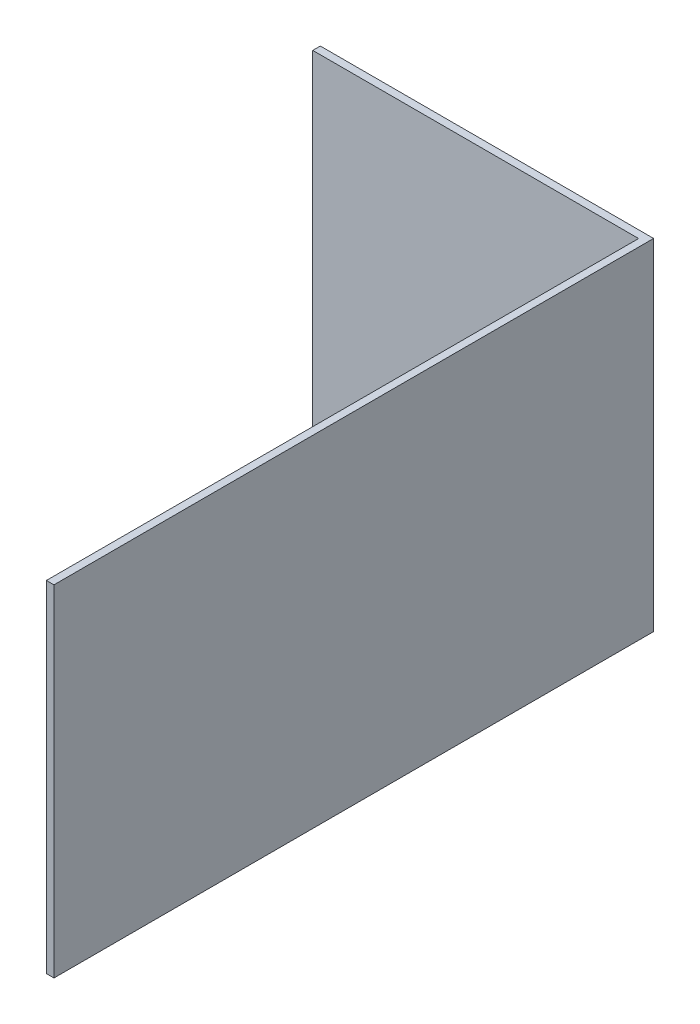
ISO-10303-21;
HEADER;
FILE_DESCRIPTION(('STEP AP214'),'2;1');
FILE_NAME('part.step','',(''),(''),'','','');
FILE_SCHEMA(('AUTOMOTIVE_DESIGN { 1 0 10303 214 1 1 1 1 }'));
ENDSEC;
DATA;
#1=APPLICATION_CONTEXT('core data for automotive mechanical design processes');
#2=APPLICATION_PROTOCOL_DEFINITION('international standard','automotive_design',2000,#1);
#3=PRODUCT_CONTEXT('',#1,'mechanical');
#4=PRODUCT('Part','Part','',(#3));
#5=PRODUCT_RELATED_PRODUCT_CATEGORY('part','',(#4));
#6=PRODUCT_DEFINITION_FORMATION('','',#4);
#7=PRODUCT_DEFINITION_CONTEXT('part definition',#1,'design');
#8=PRODUCT_DEFINITION('design','',#6,#7);
#9=PRODUCT_DEFINITION_SHAPE('','',#8);
#10=(LENGTH_UNIT() NAMED_UNIT(*) SI_UNIT(.MILLI.,.METRE.));
#11=(NAMED_UNIT(*) PLANE_ANGLE_UNIT() SI_UNIT($,.RADIAN.));
#12=(NAMED_UNIT(*) SI_UNIT($,.STERADIAN.) SOLID_ANGLE_UNIT());
#13=UNCERTAINTY_MEASURE_WITH_UNIT(LENGTH_MEASURE(1.E-05),#10,'distance_accuracy_value','');
#14=(GEOMETRIC_REPRESENTATION_CONTEXT(3) GLOBAL_UNCERTAINTY_ASSIGNED_CONTEXT((#13)) GLOBAL_UNIT_ASSIGNED_CONTEXT((#10,
#11,#12)) REPRESENTATION_CONTEXT('',''));
#15=CARTESIAN_POINT('',(0.,0.,0.));
#16=DIRECTION('',(0.,0.,1.));
#17=DIRECTION('',(1.,0.,0.));
#18=AXIS2_PLACEMENT_3D('',#15,#16,#17);
#19=CARTESIAN_POINT('',(359.999999999999,674.135566945079,-438.210637314264));
#20=DIRECTION('',(-0.999999965730541,0.,0.000261799384801581));
#21=DIRECTION('',(0.000261799384801581,0.,0.999999965730541));
#22=AXIS2_PLACEMENT_3D('',#19,#20,#21);
#23=PLANE('',#22);
#24=DIRECTION('',(-0.00026179938480158,0.,-0.999999965730541));
#25=VECTOR('',#24,1.);
#26=CARTESIAN_POINT('',(359.999999999999,0.,-438.210637314264));
#27=LINE('',#26,#25);
#28=CARTESIAN_POINT('',(360.310885989529,0.,749.286342905713));
#29=VERTEX_POINT('',#28);
#30=CARTESIAN_POINT('',(359.999999999999,0.,-438.210637314264));
#31=VERTEX_POINT('',#30);
#32=EDGE_CURVE('E117',#29,#31,#27,.T.);
#33=ORIENTED_EDGE('',*,*,#32,.T.);
#34=DIRECTION('',(0.,-1.,0.));
#35=VECTOR('',#34,1.);
#36=CARTESIAN_POINT('',(359.999999999999,674.135566945079,-438.210637314264));
#37=LINE('',#36,#35);
#38=CARTESIAN_POINT('',(359.999999999999,674.135566945079,-438.210637314264));
#39=VERTEX_POINT('',#38);
#40=EDGE_CURVE('E11',#39,#31,#37,.T.);
#41=ORIENTED_EDGE('',*,*,#40,.F.);
#42=DIRECTION('',(-0.00026179938480158,0.,-0.999999965730541));
#43=VECTOR('',#42,1.);
#44=CARTESIAN_POINT('',(359.999999999999,674.135566945079,-438.210637314264));
#45=LINE('',#44,#43);
#46=CARTESIAN_POINT('',(360.310885989529,674.135566945079,749.286342905713));
#47=VERTEX_POINT('',#46);
#48=EDGE_CURVE('E127',#47,#39,#45,.T.);
#49=ORIENTED_EDGE('',*,*,#48,.F.);
#50=DIRECTION('',(0.,-1.,0.));
#51=VECTOR('',#50,1.);
#52=CARTESIAN_POINT('',(360.310885989529,674.135566945079,749.286342905713));
#53=LINE('',#52,#51);
#54=EDGE_CURVE('E113',#47,#29,#53,.T.);
#55=ORIENTED_EDGE('',*,*,#54,.T.);
#56=EDGE_LOOP('',(#33,#41,#49,#55));
#57=FACE_BOUND('',#56,.T.);
#58=ADVANCED_FACE('F33',(#57),#23,.F.);
#59=CARTESIAN_POINT('',(-299.880046861604,674.135566945079,-438.210637314264));
#60=DIRECTION('',(0.,0.,1.));
#61=DIRECTION('',(1.,0.,0.));
#62=AXIS2_PLACEMENT_3D('',#59,#60,#61);
#63=PLANE('',#62);
#64=DIRECTION('',(-1.,0.,0.));
#65=VECTOR('',#64,1.);
#66=CARTESIAN_POINT('',(-299.880046861604,0.,-438.210637314264));
#67=LINE('',#66,#65);
#68=CARTESIAN_POINT('',(-299.880046861604,0.,-438.210637314264));
#69=VERTEX_POINT('',#68);
#70=EDGE_CURVE('E120',#31,#69,#67,.T.);
#71=ORIENTED_EDGE('',*,*,#70,.T.);
#72=DIRECTION('',(0.,-1.,0.));
#73=VECTOR('',#72,1.);
#74=CARTESIAN_POINT('',(-299.880046861604,674.135566945079,-438.210637314264));
#75=LINE('',#74,#73);
#76=CARTESIAN_POINT('',(-299.880046861604,674.135566945079,-438.210637314264));
#77=VERTEX_POINT('',#76);
#78=EDGE_CURVE('E41',#77,#69,#75,.T.);
#79=ORIENTED_EDGE('',*,*,#78,.F.);
#80=DIRECTION('',(-1.,0.,0.));
#81=VECTOR('',#80,1.);
#82=CARTESIAN_POINT('',(-299.880046861604,674.135566945079,-438.210637314264));
#83=LINE('',#82,#81);
#84=EDGE_CURVE('E86',#39,#77,#83,.T.);
#85=ORIENTED_EDGE('',*,*,#84,.F.);
#86=ORIENTED_EDGE('',*,*,#40,.T.);
#87=EDGE_LOOP('',(#71,#79,#85,#86));
#88=FACE_BOUND('',#87,.T.);
#89=ADVANCED_FACE('F151',(#88),#63,.F.);
#90=CARTESIAN_POINT('',(-299.880046861603,674.135566945079,-423.210637314775));
#91=DIRECTION('',(1.,0.,0.));
#92=DIRECTION('',(0.,0.,-1.));
#93=AXIS2_PLACEMENT_3D('',#90,#91,#92);
#94=PLANE('',#93);
#95=DIRECTION('',(0.,0.,1.));
#96=VECTOR('',#95,1.);
#97=CARTESIAN_POINT('',(-299.880046861603,0.,-423.210637314775));
#98=LINE('',#97,#96);
#99=CARTESIAN_POINT('',(-299.880046861603,0.,-423.210637314775));
#100=VERTEX_POINT('',#99);
#101=EDGE_CURVE('E122',#69,#100,#98,.T.);
#102=ORIENTED_EDGE('',*,*,#101,.T.);
#103=DIRECTION('',(0.,-1.,0.));
#104=VECTOR('',#103,1.);
#105=CARTESIAN_POINT('',(-299.880046861603,674.135566945079,-423.210637314775));
#106=LINE('',#105,#104);
#107=CARTESIAN_POINT('',(-299.880046861603,674.135566945079,-423.210637314775));
#108=VERTEX_POINT('',#107);
#109=EDGE_CURVE('E108',#108,#100,#106,.T.);
#110=ORIENTED_EDGE('',*,*,#109,.F.);
#111=DIRECTION('',(0.,0.,1.));
#112=VECTOR('',#111,1.);
#113=CARTESIAN_POINT('',(-299.880046861603,674.135566945079,-423.210637314775));
#114=LINE('',#113,#112);
#115=EDGE_CURVE('E99',#77,#108,#114,.T.);
#116=ORIENTED_EDGE('',*,*,#115,.F.);
#117=ORIENTED_EDGE('',*,*,#78,.T.);
#118=EDGE_LOOP('',(#102,#110,#116,#117));
#119=FACE_BOUND('',#118,.T.);
#120=ADVANCED_FACE('F133',(#119),#94,.F.);
#121=CARTESIAN_POINT('',(345.31088598953,674.135566945079,-423.210637314775));
#122=DIRECTION('',(0.,0.,-1.));
#123=DIRECTION('',(-1.,0.,0.));
#124=AXIS2_PLACEMENT_3D('',#121,#122,#123);
#125=PLANE('',#124);
#126=DIRECTION('',(1.,0.,0.));
#127=VECTOR('',#126,1.);
#128=CARTESIAN_POINT('',(345.31088598953,0.,-423.210637314775));
#129=LINE('',#128,#127);
#130=CARTESIAN_POINT('',(345.31088598953,0.,-423.210637314775));
#131=VERTEX_POINT('',#130);
#132=EDGE_CURVE('E107',#100,#131,#129,.T.);
#133=ORIENTED_EDGE('',*,*,#132,.T.);
#134=DIRECTION('',(0.,-1.,0.));
#135=VECTOR('',#134,1.);
#136=CARTESIAN_POINT('',(345.31088598953,674.135566945079,-423.210637314775));
#137=LINE('',#136,#135);
#138=CARTESIAN_POINT('',(345.31088598953,674.135566945079,-423.210637314775));
#139=VERTEX_POINT('',#138);
#140=EDGE_CURVE('E104',#139,#131,#137,.T.);
#141=ORIENTED_EDGE('',*,*,#140,.F.);
#142=DIRECTION('',(1.,0.,0.));
#143=VECTOR('',#142,1.);
#144=CARTESIAN_POINT('',(345.31088598953,674.135566945079,-423.210637314775));
#145=LINE('',#144,#143);
#146=EDGE_CURVE('E93',#108,#139,#145,.T.);
#147=ORIENTED_EDGE('',*,*,#146,.F.);
#148=ORIENTED_EDGE('',*,*,#109,.T.);
#149=EDGE_LOOP('',(#133,#141,#147,#148));
#150=FACE_BOUND('',#149,.T.);
#151=ADVANCED_FACE('F105',(#150),#125,.F.);
#152=CARTESIAN_POINT('',(345.310885989529,674.135566945079,749.286342905713));
#153=DIRECTION('',(1.,0.,0.));
#154=DIRECTION('',(0.,0.,-1.));
#155=AXIS2_PLACEMENT_3D('',#152,#153,#154);
#156=PLANE('',#155);
#157=DIRECTION('',(0.,0.,1.));
#158=VECTOR('',#157,1.);
#159=CARTESIAN_POINT('',(345.310885989529,0.,749.286342905713));
#160=LINE('',#159,#158);
#161=CARTESIAN_POINT('',(345.310885989529,0.,749.286342905713));
#162=VERTEX_POINT('',#161);
#163=EDGE_CURVE('E72',#131,#162,#160,.T.);
#164=ORIENTED_EDGE('',*,*,#163,.T.);
#165=DIRECTION('',(0.,-1.,0.));
#166=VECTOR('',#165,1.);
#167=CARTESIAN_POINT('',(345.310885989529,674.135566945079,749.286342905713));
#168=LINE('',#167,#166);
#169=CARTESIAN_POINT('',(345.310885989529,674.135566945079,749.286342905713));
#170=VERTEX_POINT('',#169);
#171=EDGE_CURVE('E109',#170,#162,#168,.T.);
#172=ORIENTED_EDGE('',*,*,#171,.F.);
#173=DIRECTION('',(0.,0.,1.));
#174=VECTOR('',#173,1.);
#175=CARTESIAN_POINT('',(345.310885989529,674.135566945079,749.286342905713));
#176=LINE('',#175,#174);
#177=EDGE_CURVE('E97',#139,#170,#176,.T.);
#178=ORIENTED_EDGE('',*,*,#177,.F.);
#179=ORIENTED_EDGE('',*,*,#140,.T.);
#180=EDGE_LOOP('',(#164,#172,#178,#179));
#181=FACE_BOUND('',#180,.T.);
#182=ADVANCED_FACE('F111',(#181),#156,.F.);
#183=CARTESIAN_POINT('',(345.310885989529,674.135566945079,749.286342905713));
#184=DIRECTION('',(0.,0.,-1.));
#185=DIRECTION('',(-1.,0.,0.));
#186=AXIS2_PLACEMENT_3D('',#183,#184,#185);
#187=PLANE('',#186);
#188=DIRECTION('',(1.,0.,0.));
#189=VECTOR('',#188,1.);
#190=CARTESIAN_POINT('',(345.310885989529,0.,749.286342905713));
#191=LINE('',#190,#189);
#192=EDGE_CURVE('E78',#162,#29,#191,.T.);
#193=ORIENTED_EDGE('',*,*,#192,.T.);
#194=ORIENTED_EDGE('',*,*,#54,.F.);
#195=DIRECTION('',(1.,0.,0.));
#196=VECTOR('',#195,1.);
#197=CARTESIAN_POINT('',(345.310885989529,674.135566945079,749.286342905713));
#198=LINE('',#197,#196);
#199=EDGE_CURVE('E49',#170,#47,#198,.T.);
#200=ORIENTED_EDGE('',*,*,#199,.F.);
#201=ORIENTED_EDGE('',*,*,#171,.T.);
#202=EDGE_LOOP('',(#193,#194,#200,#201));
#203=FACE_BOUND('',#202,.T.);
#204=ADVANCED_FACE('F140',(#203),#187,.F.);
#205=CARTESIAN_POINT('',(0.,674.135566945079,0.));
#206=DIRECTION('',(0.,1.,0.));
#207=DIRECTION('',(0.,0.,1.));
#208=AXIS2_PLACEMENT_3D('',#205,#206,#207);
#209=PLANE('',#208);
#210=ORIENTED_EDGE('',*,*,#48,.T.);
#211=ORIENTED_EDGE('',*,*,#84,.T.);
#212=ORIENTED_EDGE('',*,*,#115,.T.);
#213=ORIENTED_EDGE('',*,*,#146,.T.);
#214=ORIENTED_EDGE('',*,*,#177,.T.);
#215=ORIENTED_EDGE('',*,*,#199,.T.);
#216=EDGE_LOOP('',(#210,#211,#212,#213,#214,#215));
#217=FACE_BOUND('',#216,.T.);
#218=ADVANCED_FACE('F95',(#217),#209,.T.);
#219=CARTESIAN_POINT('',(0.,0.,0.));
#220=DIRECTION('',(0.,1.,0.));
#221=DIRECTION('',(0.,0.,1.));
#222=AXIS2_PLACEMENT_3D('',#219,#220,#221);
#223=PLANE('',#222);
#224=ORIENTED_EDGE('',*,*,#32,.F.);
#225=ORIENTED_EDGE('',*,*,#192,.F.);
#226=ORIENTED_EDGE('',*,*,#163,.F.);
#227=ORIENTED_EDGE('',*,*,#132,.F.);
#228=ORIENTED_EDGE('',*,*,#101,.F.);
#229=ORIENTED_EDGE('',*,*,#70,.F.);
#230=EDGE_LOOP('',(#224,#225,#226,#227,#228,#229));
#231=FACE_BOUND('',#230,.T.);
#232=ADVANCED_FACE('F136',(#231),#223,.F.);
#233=CLOSED_SHELL('',(#58,#89,#120,#151,#182,#204,#218,#232));
#234=MANIFOLD_SOLID_BREP('B2',#233);
#235=ADVANCED_BREP_SHAPE_REPRESENTATION('',(#18,#234),#14);
#236=SHAPE_DEFINITION_REPRESENTATION(#9,#235);
ENDSEC;
END-ISO-10303-21;
